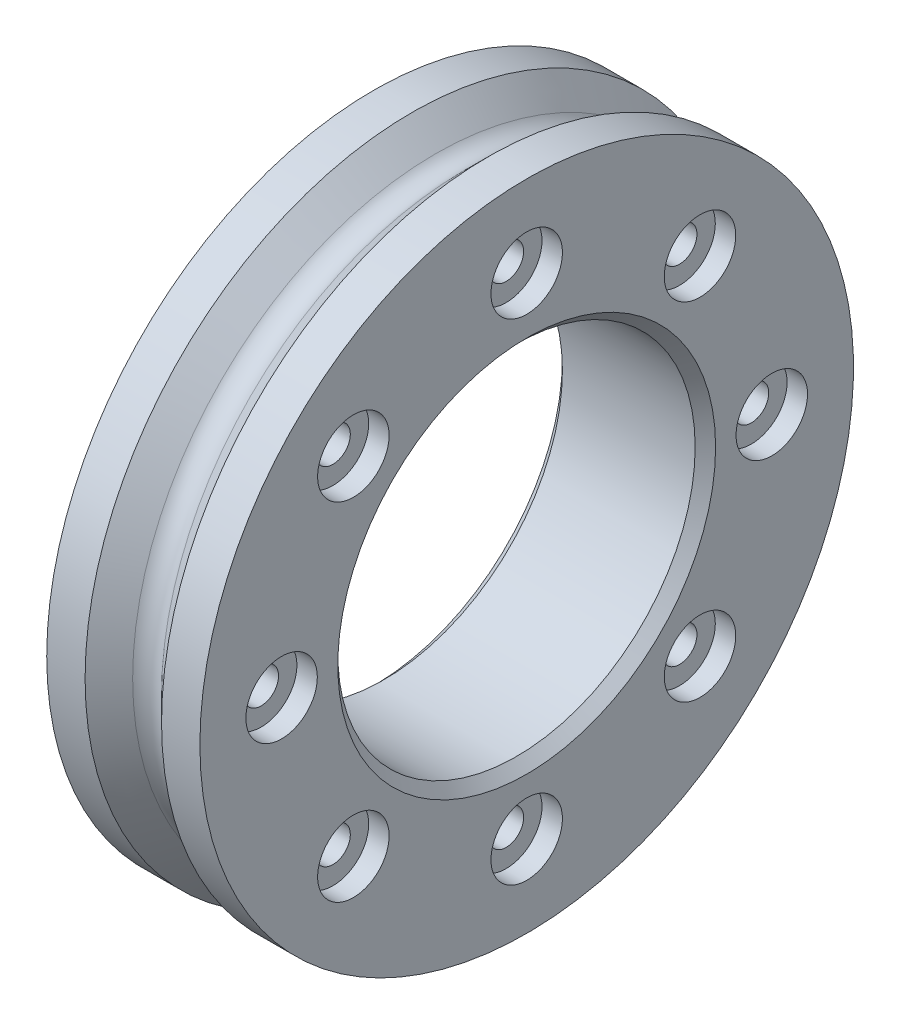
ISO-10303-21;
HEADER;
FILE_DESCRIPTION(('STEP AP214'),'2;1');
FILE_NAME('part.step','',(''),(''),'','','');
FILE_SCHEMA(('AUTOMOTIVE_DESIGN { 1 0 10303 214 1 1 1 1 }'));
ENDSEC;
DATA;
#1=APPLICATION_CONTEXT('core data for automotive mechanical design processes');
#2=APPLICATION_PROTOCOL_DEFINITION('international standard','automotive_design',2000,#1);
#3=PRODUCT_CONTEXT('',#1,'mechanical');
#4=PRODUCT('Part','Part','',(#3));
#5=PRODUCT_RELATED_PRODUCT_CATEGORY('part','',(#4));
#6=PRODUCT_DEFINITION_FORMATION('','',#4);
#7=PRODUCT_DEFINITION_CONTEXT('part definition',#1,'design');
#8=PRODUCT_DEFINITION('design','',#6,#7);
#9=PRODUCT_DEFINITION_SHAPE('','',#8);
#10=(LENGTH_UNIT() NAMED_UNIT(*) SI_UNIT(.MILLI.,.METRE.));
#11=(NAMED_UNIT(*) PLANE_ANGLE_UNIT() SI_UNIT($,.RADIAN.));
#12=(NAMED_UNIT(*) SI_UNIT($,.STERADIAN.) SOLID_ANGLE_UNIT());
#13=UNCERTAINTY_MEASURE_WITH_UNIT(LENGTH_MEASURE(1.E-05),#10,'distance_accuracy_value','');
#14=(GEOMETRIC_REPRESENTATION_CONTEXT(3) GLOBAL_UNCERTAINTY_ASSIGNED_CONTEXT((#13)) GLOBAL_UNIT_ASSIGNED_CONTEXT((#10,
#11,#12)) REPRESENTATION_CONTEXT('',''));
#15=CARTESIAN_POINT('',(0.,0.,0.));
#16=DIRECTION('',(0.,0.,1.));
#17=DIRECTION('',(1.,0.,0.));
#18=AXIS2_PLACEMENT_3D('',#15,#16,#17);
#19=CARTESIAN_POINT('',(-3.74264068711929,0.,0.));
#20=DIRECTION('',(-1.,0.,0.));
#21=DIRECTION('',(0.,0.,1.));
#22=AXIS2_PLACEMENT_3D('',#19,#20,#21);
#23=CONICAL_SURFACE('',#22,32.,0.785398163397447);
#24=CARTESIAN_POINT('',(-1.4142135623731,0.,0.));
#25=DIRECTION('',(1.,0.,0.));
#26=DIRECTION('',(0.,0.,-1.));
#27=AXIS2_PLACEMENT_3D('',#24,#25,#26);
#28=CIRCLE('',#27,29.6715728752538);
#29=CARTESIAN_POINT('',(-1.4142135623731,0.,-29.6715728752538));
#30=VERTEX_POINT('',#29);
#31=EDGE_CURVE('E39',#30,#30,#28,.F.);
#32=ORIENTED_EDGE('',*,*,#31,.T.);
#33=EDGE_LOOP('',(#32));
#34=FACE_BOUND('',#33,.T.);
#35=CARTESIAN_POINT('',(-3.74264068711929,0.,0.));
#36=DIRECTION('',(-1.,0.,0.));
#37=DIRECTION('',(0.,0.,1.));
#38=AXIS2_PLACEMENT_3D('',#35,#36,#37);
#39=CIRCLE('',#38,32.);
#40=CARTESIAN_POINT('',(-3.74264068711929,0.,32.));
#41=VERTEX_POINT('',#40);
#42=EDGE_CURVE('E58',#41,#41,#39,.T.);
#43=ORIENTED_EDGE('',*,*,#42,.F.);
#44=EDGE_LOOP('',(#43));
#45=FACE_BOUND('',#44,.T.);
#46=ADVANCED_FACE('F32',(#34,#45),#23,.T.);
#47=CARTESIAN_POINT('',(-33.7322419359837,0.,0.));
#48=DIRECTION('',(-1.,0.,0.));
#49=DIRECTION('',(0.,0.,1.));
#50=AXIS2_PLACEMENT_3D('',#47,#48,#49);
#51=CYLINDRICAL_SURFACE('',#50,32.);
#52=CARTESIAN_POINT('',(-7.5,0.,0.));
#53=DIRECTION('',(-1.,0.,0.));
#54=DIRECTION('',(0.,0.,1.));
#55=AXIS2_PLACEMENT_3D('',#52,#53,#54);
#56=CIRCLE('',#55,32.);
#57=CARTESIAN_POINT('',(-7.5,0.,32.));
#58=VERTEX_POINT('',#57);
#59=EDGE_CURVE('E61',#58,#58,#56,.T.);
#60=ORIENTED_EDGE('',*,*,#59,.F.);
#61=EDGE_LOOP('',(#60));
#62=FACE_BOUND('',#61,.T.);
#63=ORIENTED_EDGE('',*,*,#42,.T.);
#64=EDGE_LOOP('',(#63));
#65=FACE_BOUND('',#64,.T.);
#66=ADVANCED_FACE('F197',(#62,#65),#51,.T.);
#67=CARTESIAN_POINT('',(-7.5,0.,0.));
#68=DIRECTION('',(1.,0.,0.));
#69=DIRECTION('',(0.,0.,-1.));
#70=AXIS2_PLACEMENT_3D('',#67,#68,#69);
#71=PLANE('',#70);
#72=CARTESIAN_POINT('',(-7.5,16.9705627484773,16.9705627484769));
#73=DIRECTION('',(1.,0.,0.));
#74=DIRECTION('',(0.,0.,-1.));
#75=AXIS2_PLACEMENT_3D('',#72,#73,#74);
#76=CIRCLE('',#75,1.7);
#77=CARTESIAN_POINT('',(-7.5,16.9705627484773,15.2705627484769));
#78=VERTEX_POINT('',#77);
#79=EDGE_CURVE('E154',#78,#78,#76,.T.);
#80=ORIENTED_EDGE('',*,*,#79,.T.);
#81=EDGE_LOOP('',(#80));
#82=FACE_BOUND('',#81,.T.);
#83=CARTESIAN_POINT('',(-7.5,2.51264191716791E-13,24.));
#84=DIRECTION('',(1.,0.,0.));
#85=DIRECTION('',(0.,0.,-1.));
#86=AXIS2_PLACEMENT_3D('',#83,#84,#85);
#87=CIRCLE('',#86,1.7);
#88=CARTESIAN_POINT('',(-7.5,2.51264191716791E-13,22.3));
#89=VERTEX_POINT('',#88);
#90=EDGE_CURVE('E142',#89,#89,#87,.T.);
#91=ORIENTED_EDGE('',*,*,#90,.T.);
#92=EDGE_LOOP('',(#91));
#93=FACE_BOUND('',#92,.T.);
#94=CARTESIAN_POINT('',(-7.5,-16.970562748477,16.9705627484773));
#95=DIRECTION('',(1.,0.,0.));
#96=DIRECTION('',(0.,0.,-1.));
#97=AXIS2_PLACEMENT_3D('',#94,#95,#96);
#98=CIRCLE('',#97,1.7);
#99=CARTESIAN_POINT('',(-7.5,-16.970562748477,15.2705627484773));
#100=VERTEX_POINT('',#99);
#101=EDGE_CURVE('E130',#100,#100,#98,.T.);
#102=ORIENTED_EDGE('',*,*,#101,.T.);
#103=EDGE_LOOP('',(#102));
#104=FACE_BOUND('',#103,.T.);
#105=CARTESIAN_POINT('',(-7.5,-24.,0.));
#106=DIRECTION('',(1.,0.,0.));
#107=DIRECTION('',(0.,0.,-1.));
#108=AXIS2_PLACEMENT_3D('',#105,#106,#107);
#109=CIRCLE('',#108,1.7);
#110=CARTESIAN_POINT('',(-7.5,-24.,-1.7));
#111=VERTEX_POINT('',#110);
#112=EDGE_CURVE('E118',#111,#111,#109,.T.);
#113=ORIENTED_EDGE('',*,*,#112,.T.);
#114=EDGE_LOOP('',(#113));
#115=FACE_BOUND('',#114,.T.);
#116=CARTESIAN_POINT('',(-7.5,-16.9705627484772,-16.9705627484771));
#117=DIRECTION('',(1.,0.,0.));
#118=DIRECTION('',(0.,0.,-1.));
#119=AXIS2_PLACEMENT_3D('',#116,#117,#118);
#120=CIRCLE('',#119,1.7);
#121=CARTESIAN_POINT('',(-7.5,-16.9705627484772,-18.670562748477));
#122=VERTEX_POINT('',#121);
#123=EDGE_CURVE('E106',#122,#122,#120,.T.);
#124=ORIENTED_EDGE('',*,*,#123,.T.);
#125=EDGE_LOOP('',(#124));
#126=FACE_BOUND('',#125,.T.);
#127=CARTESIAN_POINT('',(-7.5,0.,-24.));
#128=DIRECTION('',(1.,0.,0.));
#129=DIRECTION('',(0.,0.,-1.));
#130=AXIS2_PLACEMENT_3D('',#127,#128,#129);
#131=CIRCLE('',#130,1.7);
#132=CARTESIAN_POINT('',(-7.5,0.,-25.7));
#133=VERTEX_POINT('',#132);
#134=EDGE_CURVE('E94',#133,#133,#131,.T.);
#135=ORIENTED_EDGE('',*,*,#134,.T.);
#136=EDGE_LOOP('',(#135));
#137=FACE_BOUND('',#136,.T.);
#138=CARTESIAN_POINT('',(-7.5,16.9705627484771,-16.9705627484772));
#139=DIRECTION('',(1.,0.,0.));
#140=DIRECTION('',(0.,0.,-1.));
#141=AXIS2_PLACEMENT_3D('',#138,#139,#140);
#142=CIRCLE('',#141,1.7);
#143=CARTESIAN_POINT('',(-7.5,16.9705627484771,-18.6705627484772));
#144=VERTEX_POINT('',#143);
#145=EDGE_CURVE('E82',#144,#144,#142,.T.);
#146=ORIENTED_EDGE('',*,*,#145,.T.);
#147=EDGE_LOOP('',(#146));
#148=FACE_BOUND('',#147,.T.);
#149=CARTESIAN_POINT('',(-7.5,24.,0.));
#150=DIRECTION('',(1.,0.,0.));
#151=DIRECTION('',(0.,0.,-1.));
#152=AXIS2_PLACEMENT_3D('',#149,#150,#151);
#153=CIRCLE('',#152,1.7);
#154=CARTESIAN_POINT('',(-7.5,24.,-1.7));
#155=VERTEX_POINT('',#154);
#156=EDGE_CURVE('E70',#155,#155,#153,.T.);
#157=ORIENTED_EDGE('',*,*,#156,.T.);
#158=EDGE_LOOP('',(#157));
#159=FACE_BOUND('',#158,.T.);
#160=CARTESIAN_POINT('',(-7.5,0.,0.));
#161=DIRECTION('',(1.,0.,0.));
#162=DIRECTION('',(0.,0.,-1.));
#163=AXIS2_PLACEMENT_3D('',#160,#161,#162);
#164=CIRCLE('',#163,18.5);
#165=CARTESIAN_POINT('',(-7.5,0.,-18.5));
#166=VERTEX_POINT('',#165);
#167=EDGE_CURVE('E43',#166,#166,#164,.T.);
#168=ORIENTED_EDGE('',*,*,#167,.T.);
#169=EDGE_LOOP('',(#168));
#170=FACE_BOUND('',#169,.T.);
#171=ORIENTED_EDGE('',*,*,#59,.T.);
#172=EDGE_LOOP('',(#171));
#173=FACE_BOUND('',#172,.T.);
#174=ADVANCED_FACE('F206',(#82,#93,#104,#115,#126,#137,#148,#159,#170,#173),#71,.F.);
#175=CARTESIAN_POINT('',(-33.7322419359837,0.,0.));
#176=DIRECTION('',(-1.,0.,0.));
#177=DIRECTION('',(0.,0.,1.));
#178=AXIS2_PLACEMENT_3D('',#175,#176,#177);
#179=CYLINDRICAL_SURFACE('',#178,17.5);
#180=CARTESIAN_POINT('',(6.5,0.,0.));
#181=DIRECTION('',(1.,0.,0.));
#182=DIRECTION('',(0.,0.,-1.));
#183=AXIS2_PLACEMENT_3D('',#180,#181,#182);
#184=CIRCLE('',#183,17.5);
#185=CARTESIAN_POINT('',(6.5,0.,-17.5));
#186=VERTEX_POINT('',#185);
#187=EDGE_CURVE('E47',#186,#186,#184,.T.);
#188=ORIENTED_EDGE('',*,*,#187,.T.);
#189=EDGE_LOOP('',(#188));
#190=FACE_BOUND('',#189,.T.);
#191=CARTESIAN_POINT('',(-6.50000000000001,0.,0.));
#192=DIRECTION('',(1.,0.,0.));
#193=DIRECTION('',(0.,0.,-1.));
#194=AXIS2_PLACEMENT_3D('',#191,#192,#193);
#195=CIRCLE('',#194,17.5);
#196=CARTESIAN_POINT('',(-6.50000000000001,0.,-17.5));
#197=VERTEX_POINT('',#196);
#198=EDGE_CURVE('E52',#197,#197,#195,.F.);
#199=ORIENTED_EDGE('',*,*,#198,.T.);
#200=EDGE_LOOP('',(#199));
#201=FACE_BOUND('',#200,.T.);
#202=ADVANCED_FACE('F173',(#190,#201),#179,.F.);
#203=CARTESIAN_POINT('',(7.5,0.,0.));
#204=DIRECTION('',(1.,0.,0.));
#205=DIRECTION('',(0.,0.,-1.));
#206=AXIS2_PLACEMENT_3D('',#203,#204,#205);
#207=PLANE('',#206);
#208=CARTESIAN_POINT('',(7.5,16.9705627484773,16.9705627484769));
#209=DIRECTION('',(1.,0.,0.));
#210=DIRECTION('',(0.,0.,-1.));
#211=AXIS2_PLACEMENT_3D('',#208,#209,#210);
#212=CIRCLE('',#211,3.5);
#213=CARTESIAN_POINT('',(7.5,16.9705627484773,13.4705627484769));
#214=VERTEX_POINT('',#213);
#215=EDGE_CURVE('E163',#214,#214,#212,.T.);
#216=ORIENTED_EDGE('',*,*,#215,.F.);
#217=EDGE_LOOP('',(#216));
#218=FACE_BOUND('',#217,.T.);
#219=CARTESIAN_POINT('',(7.5,2.51264191716791E-13,24.));
#220=DIRECTION('',(1.,0.,0.));
#221=DIRECTION('',(0.,0.,-1.));
#222=AXIS2_PLACEMENT_3D('',#219,#220,#221);
#223=CIRCLE('',#222,3.5);
#224=CARTESIAN_POINT('',(7.5,2.51264191716791E-13,20.5));
#225=VERTEX_POINT('',#224);
#226=EDGE_CURVE('E151',#225,#225,#223,.T.);
#227=ORIENTED_EDGE('',*,*,#226,.F.);
#228=EDGE_LOOP('',(#227));
#229=FACE_BOUND('',#228,.T.);
#230=CARTESIAN_POINT('',(7.5,-16.970562748477,16.9705627484773));
#231=DIRECTION('',(1.,0.,0.));
#232=DIRECTION('',(0.,0.,-1.));
#233=AXIS2_PLACEMENT_3D('',#230,#231,#232);
#234=CIRCLE('',#233,3.5);
#235=CARTESIAN_POINT('',(7.5,-16.970562748477,13.4705627484773));
#236=VERTEX_POINT('',#235);
#237=EDGE_CURVE('E139',#236,#236,#234,.T.);
#238=ORIENTED_EDGE('',*,*,#237,.F.);
#239=EDGE_LOOP('',(#238));
#240=FACE_BOUND('',#239,.T.);
#241=CARTESIAN_POINT('',(7.5,-24.,0.));
#242=DIRECTION('',(1.,0.,0.));
#243=DIRECTION('',(0.,0.,-1.));
#244=AXIS2_PLACEMENT_3D('',#241,#242,#243);
#245=CIRCLE('',#244,3.5);
#246=CARTESIAN_POINT('',(7.5,-24.,-3.5));
#247=VERTEX_POINT('',#246);
#248=EDGE_CURVE('E127',#247,#247,#245,.T.);
#249=ORIENTED_EDGE('',*,*,#248,.F.);
#250=EDGE_LOOP('',(#249));
#251=FACE_BOUND('',#250,.T.);
#252=CARTESIAN_POINT('',(7.5,-16.9705627484772,-16.9705627484771));
#253=DIRECTION('',(1.,0.,0.));
#254=DIRECTION('',(0.,0.,-1.));
#255=AXIS2_PLACEMENT_3D('',#252,#253,#254);
#256=CIRCLE('',#255,3.5);
#257=CARTESIAN_POINT('',(7.5,-16.9705627484772,-20.4705627484771));
#258=VERTEX_POINT('',#257);
#259=EDGE_CURVE('E115',#258,#258,#256,.T.);
#260=ORIENTED_EDGE('',*,*,#259,.F.);
#261=EDGE_LOOP('',(#260));
#262=FACE_BOUND('',#261,.T.);
#263=CARTESIAN_POINT('',(7.5,0.,-24.));
#264=DIRECTION('',(1.,0.,0.));
#265=DIRECTION('',(0.,0.,-1.));
#266=AXIS2_PLACEMENT_3D('',#263,#264,#265);
#267=CIRCLE('',#266,3.5);
#268=CARTESIAN_POINT('',(7.5,0.,-27.5));
#269=VERTEX_POINT('',#268);
#270=EDGE_CURVE('E103',#269,#269,#267,.T.);
#271=ORIENTED_EDGE('',*,*,#270,.F.);
#272=EDGE_LOOP('',(#271));
#273=FACE_BOUND('',#272,.T.);
#274=CARTESIAN_POINT('',(7.5,16.9705627484771,-16.9705627484772));
#275=DIRECTION('',(1.,0.,0.));
#276=DIRECTION('',(0.,0.,-1.));
#277=AXIS2_PLACEMENT_3D('',#274,#275,#276);
#278=CIRCLE('',#277,3.5);
#279=CARTESIAN_POINT('',(7.5,16.9705627484771,-20.4705627484772));
#280=VERTEX_POINT('',#279);
#281=EDGE_CURVE('E91',#280,#280,#278,.T.);
#282=ORIENTED_EDGE('',*,*,#281,.F.);
#283=EDGE_LOOP('',(#282));
#284=FACE_BOUND('',#283,.T.);
#285=CARTESIAN_POINT('',(7.5,24.,0.));
#286=DIRECTION('',(1.,0.,0.));
#287=DIRECTION('',(0.,0.,-1.));
#288=AXIS2_PLACEMENT_3D('',#285,#286,#287);
#289=CIRCLE('',#288,3.5);
#290=CARTESIAN_POINT('',(7.5,24.,-3.5));
#291=VERTEX_POINT('',#290);
#292=EDGE_CURVE('E79',#291,#291,#289,.T.);
#293=ORIENTED_EDGE('',*,*,#292,.F.);
#294=EDGE_LOOP('',(#293));
#295=FACE_BOUND('',#294,.T.);
#296=CARTESIAN_POINT('',(7.5,0.,0.));
#297=DIRECTION('',(1.,0.,0.));
#298=DIRECTION('',(0.,0.,-1.));
#299=AXIS2_PLACEMENT_3D('',#296,#297,#298);
#300=CIRCLE('',#299,18.5);
#301=CARTESIAN_POINT('',(7.5,0.,-18.5));
#302=VERTEX_POINT('',#301);
#303=EDGE_CURVE('E55',#302,#302,#300,.F.);
#304=ORIENTED_EDGE('',*,*,#303,.T.);
#305=EDGE_LOOP('',(#304));
#306=FACE_BOUND('',#305,.T.);
#307=CARTESIAN_POINT('',(7.5,0.,0.));
#308=DIRECTION('',(-1.,0.,0.));
#309=DIRECTION('',(0.,0.,1.));
#310=AXIS2_PLACEMENT_3D('',#307,#308,#309);
#311=CIRCLE('',#310,32.);
#312=CARTESIAN_POINT('',(7.5,0.,32.));
#313=VERTEX_POINT('',#312);
#314=EDGE_CURVE('E64',#313,#313,#311,.T.);
#315=ORIENTED_EDGE('',*,*,#314,.F.);
#316=EDGE_LOOP('',(#315));
#317=FACE_BOUND('',#316,.T.);
#318=ADVANCED_FACE('F169',(#218,#229,#240,#251,#262,#273,#284,#295,#306,#317),#207,.T.);
#319=CARTESIAN_POINT('',(3.74264068711929,0.,0.));
#320=DIRECTION('',(-1.,0.,0.));
#321=DIRECTION('',(0.,0.,1.));
#322=AXIS2_PLACEMENT_3D('',#319,#320,#321);
#323=CIRCLE('',#322,32.);
#324=CARTESIAN_POINT('',(3.74264068711929,0.,32.));
#325=VERTEX_POINT('',#324);
#326=EDGE_CURVE('E67',#325,#325,#323,.T.);
#327=ORIENTED_EDGE('',*,*,#326,.F.);
#328=EDGE_LOOP('',(#327));
#329=FACE_BOUND('',#328,.T.);
#330=ORIENTED_EDGE('',*,*,#314,.T.);
#331=EDGE_LOOP('',(#330));
#332=FACE_BOUND('',#331,.T.);
#333=ADVANCED_FACE('F172',(#329,#332),#51,.T.);
#334=CARTESIAN_POINT('',(3.74264068711929,0.,0.));
#335=DIRECTION('',(1.,0.,0.));
#336=DIRECTION('',(0.,0.,-1.));
#337=AXIS2_PLACEMENT_3D('',#334,#335,#336);
#338=CONICAL_SURFACE('',#337,32.,0.785398163397449);
#339=CARTESIAN_POINT('',(1.4142135623731,0.,0.));
#340=DIRECTION('',(-1.,0.,0.));
#341=DIRECTION('',(0.,0.,1.));
#342=AXIS2_PLACEMENT_3D('',#339,#340,#341);
#343=CIRCLE('',#342,29.6715728752538);
#344=CARTESIAN_POINT('',(1.4142135623731,0.,29.6715728752538));
#345=VERTEX_POINT('',#344);
#346=EDGE_CURVE('E10',#345,#345,#343,.F.);
#347=ORIENTED_EDGE('',*,*,#346,.T.);
#348=EDGE_LOOP('',(#347));
#349=FACE_BOUND('',#348,.T.);
#350=ORIENTED_EDGE('',*,*,#326,.T.);
#351=EDGE_LOOP('',(#350));
#352=FACE_BOUND('',#351,.T.);
#353=ADVANCED_FACE('F194',(#349,#352),#338,.T.);
#354=CARTESIAN_POINT('',(7.5,0.,0.));
#355=DIRECTION('',(1.,0.,0.));
#356=DIRECTION('',(0.,0.,-1.));
#357=AXIS2_PLACEMENT_3D('',#354,#355,#356);
#358=CONICAL_SURFACE('',#357,18.5,0.785398163397448);
#359=ORIENTED_EDGE('',*,*,#187,.F.);
#360=EDGE_LOOP('',(#359));
#361=FACE_BOUND('',#360,.T.);
#362=ORIENTED_EDGE('',*,*,#303,.F.);
#363=EDGE_LOOP('',(#362));
#364=FACE_BOUND('',#363,.T.);
#365=ADVANCED_FACE('F202',(#361,#364),#358,.F.);
#366=CARTESIAN_POINT('',(-6.50000000000001,0.,0.));
#367=DIRECTION('',(-1.,0.,0.));
#368=DIRECTION('',(0.,0.,1.));
#369=AXIS2_PLACEMENT_3D('',#366,#367,#368);
#370=CONICAL_SURFACE('',#369,17.5,0.785398163397452);
#371=ORIENTED_EDGE('',*,*,#167,.F.);
#372=EDGE_LOOP('',(#371));
#373=FACE_BOUND('',#372,.T.);
#374=ORIENTED_EDGE('',*,*,#198,.F.);
#375=EDGE_LOOP('',(#374));
#376=FACE_BOUND('',#375,.T.);
#377=ADVANCED_FACE('F217',(#373,#376),#370,.F.);
#378=CARTESIAN_POINT('',(0.,0.,0.));
#379=DIRECTION('',(-1.,0.,0.));
#380=DIRECTION('',(0.,0.,1.));
#381=AXIS2_PLACEMENT_3D('',#378,#379,#380);
#382=TOROIDAL_SURFACE('',#381,31.0857864376269,2.);
#383=ORIENTED_EDGE('',*,*,#346,.F.);
#384=EDGE_LOOP('',(#383));
#385=FACE_BOUND('',#384,.T.);
#386=ORIENTED_EDGE('',*,*,#31,.F.);
#387=EDGE_LOOP('',(#386));
#388=FACE_BOUND('',#387,.T.);
#389=ADVANCED_FACE('F34',(#385,#388),#382,.F.);
#390=CARTESIAN_POINT('',(7.5,24.,0.));
#391=DIRECTION('',(1.,0.,0.));
#392=DIRECTION('',(0.,0.,-1.));
#393=AXIS2_PLACEMENT_3D('',#390,#391,#392);
#394=CYLINDRICAL_SURFACE('',#393,1.7);
#395=ORIENTED_EDGE('',*,*,#156,.F.);
#396=EDGE_LOOP('',(#395));
#397=FACE_BOUND('',#396,.T.);
#398=CARTESIAN_POINT('',(5.5,24.,0.));
#399=DIRECTION('',(1.,0.,0.));
#400=DIRECTION('',(0.,0.,-1.));
#401=AXIS2_PLACEMENT_3D('',#398,#399,#400);
#402=CIRCLE('',#401,1.7);
#403=CARTESIAN_POINT('',(5.5,24.,-1.7));
#404=VERTEX_POINT('',#403);
#405=EDGE_CURVE('E73',#404,#404,#402,.T.);
#406=ORIENTED_EDGE('',*,*,#405,.T.);
#407=EDGE_LOOP('',(#406));
#408=FACE_BOUND('',#407,.T.);
#409=ADVANCED_FACE('F224',(#397,#408),#394,.F.);
#410=CARTESIAN_POINT('',(5.5,25.7,0.));
#411=DIRECTION('',(-1.,0.,0.));
#412=DIRECTION('',(0.,0.,1.));
#413=AXIS2_PLACEMENT_3D('',#410,#411,#412);
#414=PLANE('',#413);
#415=ORIENTED_EDGE('',*,*,#405,.F.);
#416=EDGE_LOOP('',(#415));
#417=FACE_BOUND('',#416,.T.);
#418=CARTESIAN_POINT('',(5.5,24.,0.));
#419=DIRECTION('',(1.,0.,0.));
#420=DIRECTION('',(0.,0.,-1.));
#421=AXIS2_PLACEMENT_3D('',#418,#419,#420);
#422=CIRCLE('',#421,3.5);
#423=CARTESIAN_POINT('',(5.5,24.,-3.5));
#424=VERTEX_POINT('',#423);
#425=EDGE_CURVE('E76',#424,#424,#422,.T.);
#426=ORIENTED_EDGE('',*,*,#425,.T.);
#427=EDGE_LOOP('',(#426));
#428=FACE_BOUND('',#427,.T.);
#429=ADVANCED_FACE('F264',(#417,#428),#414,.F.);
#430=CARTESIAN_POINT('',(7.5,24.,0.));
#431=DIRECTION('',(1.,0.,0.));
#432=DIRECTION('',(0.,0.,-1.));
#433=AXIS2_PLACEMENT_3D('',#430,#431,#432);
#434=CYLINDRICAL_SURFACE('',#433,3.5);
#435=ORIENTED_EDGE('',*,*,#425,.F.);
#436=EDGE_LOOP('',(#435));
#437=FACE_BOUND('',#436,.T.);
#438=ORIENTED_EDGE('',*,*,#292,.T.);
#439=EDGE_LOOP('',(#438));
#440=FACE_BOUND('',#439,.T.);
#441=ADVANCED_FACE('F270',(#437,#440),#434,.F.);
#442=CARTESIAN_POINT('',(7.5,16.9705627484771,-16.9705627484772));
#443=DIRECTION('',(1.,0.,0.));
#444=DIRECTION('',(0.,0.,-1.));
#445=AXIS2_PLACEMENT_3D('',#442,#443,#444);
#446=CYLINDRICAL_SURFACE('',#445,1.7);
#447=ORIENTED_EDGE('',*,*,#145,.F.);
#448=EDGE_LOOP('',(#447));
#449=FACE_BOUND('',#448,.T.);
#450=CARTESIAN_POINT('',(5.5,16.9705627484771,-16.9705627484772));
#451=DIRECTION('',(1.,0.,0.));
#452=DIRECTION('',(0.,0.,-1.));
#453=AXIS2_PLACEMENT_3D('',#450,#451,#452);
#454=CIRCLE('',#453,1.7);
#455=CARTESIAN_POINT('',(5.5,16.9705627484771,-18.6705627484772));
#456=VERTEX_POINT('',#455);
#457=EDGE_CURVE('E85',#456,#456,#454,.T.);
#458=ORIENTED_EDGE('',*,*,#457,.T.);
#459=EDGE_LOOP('',(#458));
#460=FACE_BOUND('',#459,.T.);
#461=ADVANCED_FACE('F276',(#449,#460),#446,.F.);
#462=CARTESIAN_POINT('',(5.5,18.6705627484771,-16.9705627484772));
#463=DIRECTION('',(-1.,0.,0.));
#464=DIRECTION('',(0.,0.,1.));
#465=AXIS2_PLACEMENT_3D('',#462,#463,#464);
#466=PLANE('',#465);
#467=ORIENTED_EDGE('',*,*,#457,.F.);
#468=EDGE_LOOP('',(#467));
#469=FACE_BOUND('',#468,.T.);
#470=CARTESIAN_POINT('',(5.5,16.9705627484771,-16.9705627484772));
#471=DIRECTION('',(1.,0.,0.));
#472=DIRECTION('',(0.,0.,-1.));
#473=AXIS2_PLACEMENT_3D('',#470,#471,#472);
#474=CIRCLE('',#473,3.5);
#475=CARTESIAN_POINT('',(5.5,16.9705627484771,-20.4705627484772));
#476=VERTEX_POINT('',#475);
#477=EDGE_CURVE('E88',#476,#476,#474,.T.);
#478=ORIENTED_EDGE('',*,*,#477,.T.);
#479=EDGE_LOOP('',(#478));
#480=FACE_BOUND('',#479,.T.);
#481=ADVANCED_FACE('F280',(#469,#480),#466,.F.);
#482=CARTESIAN_POINT('',(7.5,16.9705627484771,-16.9705627484772));
#483=DIRECTION('',(1.,0.,0.));
#484=DIRECTION('',(0.,0.,-1.));
#485=AXIS2_PLACEMENT_3D('',#482,#483,#484);
#486=CYLINDRICAL_SURFACE('',#485,3.5);
#487=ORIENTED_EDGE('',*,*,#477,.F.);
#488=EDGE_LOOP('',(#487));
#489=FACE_BOUND('',#488,.T.);
#490=ORIENTED_EDGE('',*,*,#281,.T.);
#491=EDGE_LOOP('',(#490));
#492=FACE_BOUND('',#491,.T.);
#493=ADVANCED_FACE('F286',(#489,#492),#486,.F.);
#494=CARTESIAN_POINT('',(7.5,0.,-24.));
#495=DIRECTION('',(1.,0.,0.));
#496=DIRECTION('',(0.,0.,-1.));
#497=AXIS2_PLACEMENT_3D('',#494,#495,#496);
#498=CYLINDRICAL_SURFACE('',#497,1.7);
#499=ORIENTED_EDGE('',*,*,#134,.F.);
#500=EDGE_LOOP('',(#499));
#501=FACE_BOUND('',#500,.T.);
#502=CARTESIAN_POINT('',(5.5,0.,-24.));
#503=DIRECTION('',(1.,0.,0.));
#504=DIRECTION('',(0.,0.,-1.));
#505=AXIS2_PLACEMENT_3D('',#502,#503,#504);
#506=CIRCLE('',#505,1.7);
#507=CARTESIAN_POINT('',(5.5,0.,-25.7));
#508=VERTEX_POINT('',#507);
#509=EDGE_CURVE('E97',#508,#508,#506,.T.);
#510=ORIENTED_EDGE('',*,*,#509,.T.);
#511=EDGE_LOOP('',(#510));
#512=FACE_BOUND('',#511,.T.);
#513=ADVANCED_FACE('F290',(#501,#512),#498,.F.);
#514=CARTESIAN_POINT('',(5.5,1.69999999999992,-24.));
#515=DIRECTION('',(-1.,0.,0.));
#516=DIRECTION('',(0.,0.,1.));
#517=AXIS2_PLACEMENT_3D('',#514,#515,#516);
#518=PLANE('',#517);
#519=ORIENTED_EDGE('',*,*,#509,.F.);
#520=EDGE_LOOP('',(#519));
#521=FACE_BOUND('',#520,.T.);
#522=CARTESIAN_POINT('',(5.5,0.,-24.));
#523=DIRECTION('',(1.,0.,0.));
#524=DIRECTION('',(0.,0.,-1.));
#525=AXIS2_PLACEMENT_3D('',#522,#523,#524);
#526=CIRCLE('',#525,3.5);
#527=CARTESIAN_POINT('',(5.5,0.,-27.5));
#528=VERTEX_POINT('',#527);
#529=EDGE_CURVE('E100',#528,#528,#526,.T.);
#530=ORIENTED_EDGE('',*,*,#529,.T.);
#531=EDGE_LOOP('',(#530));
#532=FACE_BOUND('',#531,.T.);
#533=ADVANCED_FACE('F294',(#521,#532),#518,.F.);
#534=CARTESIAN_POINT('',(7.5,0.,-24.));
#535=DIRECTION('',(1.,0.,0.));
#536=DIRECTION('',(0.,0.,-1.));
#537=AXIS2_PLACEMENT_3D('',#534,#535,#536);
#538=CYLINDRICAL_SURFACE('',#537,3.5);
#539=ORIENTED_EDGE('',*,*,#529,.F.);
#540=EDGE_LOOP('',(#539));
#541=FACE_BOUND('',#540,.T.);
#542=ORIENTED_EDGE('',*,*,#270,.T.);
#543=EDGE_LOOP('',(#542));
#544=FACE_BOUND('',#543,.T.);
#545=ADVANCED_FACE('F298',(#541,#544),#538,.F.);
#546=CARTESIAN_POINT('',(7.5,-16.9705627484772,-16.9705627484771));
#547=DIRECTION('',(1.,0.,0.));
#548=DIRECTION('',(0.,0.,-1.));
#549=AXIS2_PLACEMENT_3D('',#546,#547,#548);
#550=CYLINDRICAL_SURFACE('',#549,1.7);
#551=ORIENTED_EDGE('',*,*,#123,.F.);
#552=EDGE_LOOP('',(#551));
#553=FACE_BOUND('',#552,.T.);
#554=CARTESIAN_POINT('',(5.5,-16.9705627484772,-16.9705627484771));
#555=DIRECTION('',(1.,0.,0.));
#556=DIRECTION('',(0.,0.,-1.));
#557=AXIS2_PLACEMENT_3D('',#554,#555,#556);
#558=CIRCLE('',#557,1.7);
#559=CARTESIAN_POINT('',(5.5,-16.9705627484772,-18.6705627484771));
#560=VERTEX_POINT('',#559);
#561=EDGE_CURVE('E109',#560,#560,#558,.T.);
#562=ORIENTED_EDGE('',*,*,#561,.T.);
#563=EDGE_LOOP('',(#562));
#564=FACE_BOUND('',#563,.T.);
#565=ADVANCED_FACE('F302',(#553,#564),#550,.F.);
#566=CARTESIAN_POINT('',(5.5,-15.2705627484772,-16.9705627484771));
#567=DIRECTION('',(-1.,0.,0.));
#568=DIRECTION('',(0.,0.,1.));
#569=AXIS2_PLACEMENT_3D('',#566,#567,#568);
#570=PLANE('',#569);
#571=ORIENTED_EDGE('',*,*,#561,.F.);
#572=EDGE_LOOP('',(#571));
#573=FACE_BOUND('',#572,.T.);
#574=CARTESIAN_POINT('',(5.5,-16.9705627484772,-16.9705627484771));
#575=DIRECTION('',(1.,0.,0.));
#576=DIRECTION('',(0.,0.,-1.));
#577=AXIS2_PLACEMENT_3D('',#574,#575,#576);
#578=CIRCLE('',#577,3.5);
#579=CARTESIAN_POINT('',(5.5,-16.9705627484772,-20.4705627484771));
#580=VERTEX_POINT('',#579);
#581=EDGE_CURVE('E112',#580,#580,#578,.T.);
#582=ORIENTED_EDGE('',*,*,#581,.T.);
#583=EDGE_LOOP('',(#582));
#584=FACE_BOUND('',#583,.T.);
#585=ADVANCED_FACE('F306',(#573,#584),#570,.F.);
#586=CARTESIAN_POINT('',(7.5,-16.9705627484772,-16.9705627484771));
#587=DIRECTION('',(1.,0.,0.));
#588=DIRECTION('',(0.,0.,-1.));
#589=AXIS2_PLACEMENT_3D('',#586,#587,#588);
#590=CYLINDRICAL_SURFACE('',#589,3.5);
#591=ORIENTED_EDGE('',*,*,#581,.F.);
#592=EDGE_LOOP('',(#591));
#593=FACE_BOUND('',#592,.T.);
#594=ORIENTED_EDGE('',*,*,#259,.T.);
#595=EDGE_LOOP('',(#594));
#596=FACE_BOUND('',#595,.T.);
#597=ADVANCED_FACE('F310',(#593,#596),#590,.F.);
#598=CARTESIAN_POINT('',(7.5,-24.,0.));
#599=DIRECTION('',(1.,0.,0.));
#600=DIRECTION('',(0.,0.,-1.));
#601=AXIS2_PLACEMENT_3D('',#598,#599,#600);
#602=CYLINDRICAL_SURFACE('',#601,1.7);
#603=ORIENTED_EDGE('',*,*,#112,.F.);
#604=EDGE_LOOP('',(#603));
#605=FACE_BOUND('',#604,.T.);
#606=CARTESIAN_POINT('',(5.5,-24.,0.));
#607=DIRECTION('',(1.,0.,0.));
#608=DIRECTION('',(0.,0.,-1.));
#609=AXIS2_PLACEMENT_3D('',#606,#607,#608);
#610=CIRCLE('',#609,1.7);
#611=CARTESIAN_POINT('',(5.5,-24.,-1.7));
#612=VERTEX_POINT('',#611);
#613=EDGE_CURVE('E121',#612,#612,#610,.T.);
#614=ORIENTED_EDGE('',*,*,#613,.T.);
#615=EDGE_LOOP('',(#614));
#616=FACE_BOUND('',#615,.T.);
#617=ADVANCED_FACE('F314',(#605,#616),#602,.F.);
#618=CARTESIAN_POINT('',(5.5,-22.3,0.));
#619=DIRECTION('',(-1.,0.,0.));
#620=DIRECTION('',(0.,0.,1.));
#621=AXIS2_PLACEMENT_3D('',#618,#619,#620);
#622=PLANE('',#621);
#623=ORIENTED_EDGE('',*,*,#613,.F.);
#624=EDGE_LOOP('',(#623));
#625=FACE_BOUND('',#624,.T.);
#626=CARTESIAN_POINT('',(5.5,-24.,0.));
#627=DIRECTION('',(1.,0.,0.));
#628=DIRECTION('',(0.,0.,-1.));
#629=AXIS2_PLACEMENT_3D('',#626,#627,#628);
#630=CIRCLE('',#629,3.5);
#631=CARTESIAN_POINT('',(5.5,-24.,-3.5));
#632=VERTEX_POINT('',#631);
#633=EDGE_CURVE('E124',#632,#632,#630,.T.);
#634=ORIENTED_EDGE('',*,*,#633,.T.);
#635=EDGE_LOOP('',(#634));
#636=FACE_BOUND('',#635,.T.);
#637=ADVANCED_FACE('F318',(#625,#636),#622,.F.);
#638=CARTESIAN_POINT('',(7.5,-24.,0.));
#639=DIRECTION('',(1.,0.,0.));
#640=DIRECTION('',(0.,0.,-1.));
#641=AXIS2_PLACEMENT_3D('',#638,#639,#640);
#642=CYLINDRICAL_SURFACE('',#641,3.5);
#643=ORIENTED_EDGE('',*,*,#633,.F.);
#644=EDGE_LOOP('',(#643));
#645=FACE_BOUND('',#644,.T.);
#646=ORIENTED_EDGE('',*,*,#248,.T.);
#647=EDGE_LOOP('',(#646));
#648=FACE_BOUND('',#647,.T.);
#649=ADVANCED_FACE('F322',(#645,#648),#642,.F.);
#650=CARTESIAN_POINT('',(7.5,-16.970562748477,16.9705627484773));
#651=DIRECTION('',(1.,0.,0.));
#652=DIRECTION('',(0.,0.,-1.));
#653=AXIS2_PLACEMENT_3D('',#650,#651,#652);
#654=CYLINDRICAL_SURFACE('',#653,1.7);
#655=ORIENTED_EDGE('',*,*,#101,.F.);
#656=EDGE_LOOP('',(#655));
#657=FACE_BOUND('',#656,.T.);
#658=CARTESIAN_POINT('',(5.5,-16.970562748477,16.9705627484773));
#659=DIRECTION('',(1.,0.,0.));
#660=DIRECTION('',(0.,0.,-1.));
#661=AXIS2_PLACEMENT_3D('',#658,#659,#660);
#662=CIRCLE('',#661,1.7);
#663=CARTESIAN_POINT('',(5.5,-16.970562748477,15.2705627484773));
#664=VERTEX_POINT('',#663);
#665=EDGE_CURVE('E133',#664,#664,#662,.T.);
#666=ORIENTED_EDGE('',*,*,#665,.T.);
#667=EDGE_LOOP('',(#666));
#668=FACE_BOUND('',#667,.T.);
#669=ADVANCED_FACE('F326',(#657,#668),#654,.F.);
#670=CARTESIAN_POINT('',(5.5,-15.270562748477,16.9705627484773));
#671=DIRECTION('',(-1.,0.,0.));
#672=DIRECTION('',(0.,0.,1.));
#673=AXIS2_PLACEMENT_3D('',#670,#671,#672);
#674=PLANE('',#673);
#675=ORIENTED_EDGE('',*,*,#665,.F.);
#676=EDGE_LOOP('',(#675));
#677=FACE_BOUND('',#676,.T.);
#678=CARTESIAN_POINT('',(5.5,-16.970562748477,16.9705627484773));
#679=DIRECTION('',(1.,0.,0.));
#680=DIRECTION('',(0.,0.,-1.));
#681=AXIS2_PLACEMENT_3D('',#678,#679,#680);
#682=CIRCLE('',#681,3.5);
#683=CARTESIAN_POINT('',(5.5,-16.970562748477,13.4705627484773));
#684=VERTEX_POINT('',#683);
#685=EDGE_CURVE('E136',#684,#684,#682,.T.);
#686=ORIENTED_EDGE('',*,*,#685,.T.);
#687=EDGE_LOOP('',(#686));
#688=FACE_BOUND('',#687,.T.);
#689=ADVANCED_FACE('F330',(#677,#688),#674,.F.);
#690=CARTESIAN_POINT('',(7.5,-16.970562748477,16.9705627484773));
#691=DIRECTION('',(1.,0.,0.));
#692=DIRECTION('',(0.,0.,-1.));
#693=AXIS2_PLACEMENT_3D('',#690,#691,#692);
#694=CYLINDRICAL_SURFACE('',#693,3.5);
#695=ORIENTED_EDGE('',*,*,#685,.F.);
#696=EDGE_LOOP('',(#695));
#697=FACE_BOUND('',#696,.T.);
#698=ORIENTED_EDGE('',*,*,#237,.T.);
#699=EDGE_LOOP('',(#698));
#700=FACE_BOUND('',#699,.T.);
#701=ADVANCED_FACE('F334',(#697,#700),#694,.F.);
#702=CARTESIAN_POINT('',(7.5,2.51264191716791E-13,24.));
#703=DIRECTION('',(1.,0.,0.));
#704=DIRECTION('',(0.,0.,-1.));
#705=AXIS2_PLACEMENT_3D('',#702,#703,#704);
#706=CYLINDRICAL_SURFACE('',#705,1.7);
#707=ORIENTED_EDGE('',*,*,#90,.F.);
#708=EDGE_LOOP('',(#707));
#709=FACE_BOUND('',#708,.T.);
#710=CARTESIAN_POINT('',(5.5,2.51264191716791E-13,24.));
#711=DIRECTION('',(1.,0.,0.));
#712=DIRECTION('',(0.,0.,-1.));
#713=AXIS2_PLACEMENT_3D('',#710,#711,#712);
#714=CIRCLE('',#713,1.7);
#715=CARTESIAN_POINT('',(5.5,2.51264191716791E-13,22.3));
#716=VERTEX_POINT('',#715);
#717=EDGE_CURVE('E145',#716,#716,#714,.T.);
#718=ORIENTED_EDGE('',*,*,#717,.T.);
#719=EDGE_LOOP('',(#718));
#720=FACE_BOUND('',#719,.T.);
#721=ADVANCED_FACE('F338',(#709,#720),#706,.F.);
#722=CARTESIAN_POINT('',(5.5,1.70000000000025,24.));
#723=DIRECTION('',(-1.,0.,0.));
#724=DIRECTION('',(0.,0.,1.));
#725=AXIS2_PLACEMENT_3D('',#722,#723,#724);
#726=PLANE('',#725);
#727=ORIENTED_EDGE('',*,*,#717,.F.);
#728=EDGE_LOOP('',(#727));
#729=FACE_BOUND('',#728,.T.);
#730=CARTESIAN_POINT('',(5.5,2.51264191716791E-13,24.));
#731=DIRECTION('',(1.,0.,0.));
#732=DIRECTION('',(0.,0.,-1.));
#733=AXIS2_PLACEMENT_3D('',#730,#731,#732);
#734=CIRCLE('',#733,3.5);
#735=CARTESIAN_POINT('',(5.5,2.51264191716791E-13,20.5));
#736=VERTEX_POINT('',#735);
#737=EDGE_CURVE('E148',#736,#736,#734,.T.);
#738=ORIENTED_EDGE('',*,*,#737,.T.);
#739=EDGE_LOOP('',(#738));
#740=FACE_BOUND('',#739,.T.);
#741=ADVANCED_FACE('F342',(#729,#740),#726,.F.);
#742=CARTESIAN_POINT('',(7.5,2.51264191716791E-13,24.));
#743=DIRECTION('',(1.,0.,0.));
#744=DIRECTION('',(0.,0.,-1.));
#745=AXIS2_PLACEMENT_3D('',#742,#743,#744);
#746=CYLINDRICAL_SURFACE('',#745,3.5);
#747=ORIENTED_EDGE('',*,*,#737,.F.);
#748=EDGE_LOOP('',(#747));
#749=FACE_BOUND('',#748,.T.);
#750=ORIENTED_EDGE('',*,*,#226,.T.);
#751=EDGE_LOOP('',(#750));
#752=FACE_BOUND('',#751,.T.);
#753=ADVANCED_FACE('F346',(#749,#752),#746,.F.);
#754=CARTESIAN_POINT('',(7.5,16.9705627484773,16.9705627484769));
#755=DIRECTION('',(1.,0.,0.));
#756=DIRECTION('',(0.,0.,-1.));
#757=AXIS2_PLACEMENT_3D('',#754,#755,#756);
#758=CYLINDRICAL_SURFACE('',#757,1.7);
#759=ORIENTED_EDGE('',*,*,#79,.F.);
#760=EDGE_LOOP('',(#759));
#761=FACE_BOUND('',#760,.T.);
#762=CARTESIAN_POINT('',(5.5,16.9705627484773,16.9705627484769));
#763=DIRECTION('',(1.,0.,0.));
#764=DIRECTION('',(0.,0.,-1.));
#765=AXIS2_PLACEMENT_3D('',#762,#763,#764);
#766=CIRCLE('',#765,1.7);
#767=CARTESIAN_POINT('',(5.5,16.9705627484773,15.2705627484769));
#768=VERTEX_POINT('',#767);
#769=EDGE_CURVE('E157',#768,#768,#766,.T.);
#770=ORIENTED_EDGE('',*,*,#769,.T.);
#771=EDGE_LOOP('',(#770));
#772=FACE_BOUND('',#771,.T.);
#773=ADVANCED_FACE('F350',(#761,#772),#758,.F.);
#774=CARTESIAN_POINT('',(5.5,18.6705627484773,16.9705627484769));
#775=DIRECTION('',(-1.,0.,0.));
#776=DIRECTION('',(0.,0.,1.));
#777=AXIS2_PLACEMENT_3D('',#774,#775,#776);
#778=PLANE('',#777);
#779=ORIENTED_EDGE('',*,*,#769,.F.);
#780=EDGE_LOOP('',(#779));
#781=FACE_BOUND('',#780,.T.);
#782=CARTESIAN_POINT('',(5.5,16.9705627484773,16.9705627484769));
#783=DIRECTION('',(1.,0.,0.));
#784=DIRECTION('',(0.,0.,-1.));
#785=AXIS2_PLACEMENT_3D('',#782,#783,#784);
#786=CIRCLE('',#785,3.5);
#787=CARTESIAN_POINT('',(5.5,16.9705627484773,13.4705627484769));
#788=VERTEX_POINT('',#787);
#789=EDGE_CURVE('E160',#788,#788,#786,.T.);
#790=ORIENTED_EDGE('',*,*,#789,.T.);
#791=EDGE_LOOP('',(#790));
#792=FACE_BOUND('',#791,.T.);
#793=ADVANCED_FACE('F354',(#781,#792),#778,.F.);
#794=CARTESIAN_POINT('',(7.5,16.9705627484773,16.9705627484769));
#795=DIRECTION('',(1.,0.,0.));
#796=DIRECTION('',(0.,0.,-1.));
#797=AXIS2_PLACEMENT_3D('',#794,#795,#796);
#798=CYLINDRICAL_SURFACE('',#797,3.5);
#799=ORIENTED_EDGE('',*,*,#789,.F.);
#800=EDGE_LOOP('',(#799));
#801=FACE_BOUND('',#800,.T.);
#802=ORIENTED_EDGE('',*,*,#215,.T.);
#803=EDGE_LOOP('',(#802));
#804=FACE_BOUND('',#803,.T.);
#805=ADVANCED_FACE('F167',(#801,#804),#798,.F.);
#806=CLOSED_SHELL('',(#46,#66,#174,#202,#318,#333,#353,#365,#377,#389,#409,#429,#441,#461,#481,
#493,#513,#533,#545,#565,#585,#597,#617,#637,#649,#669,#689,#701,#721,#741,#753,#773,#793,#805));
#807=MANIFOLD_SOLID_BREP('B2',#806);
#808=ADVANCED_BREP_SHAPE_REPRESENTATION('',(#18,#807),#14);
#809=SHAPE_DEFINITION_REPRESENTATION(#9,#808);
ENDSEC;
END-ISO-10303-21;
